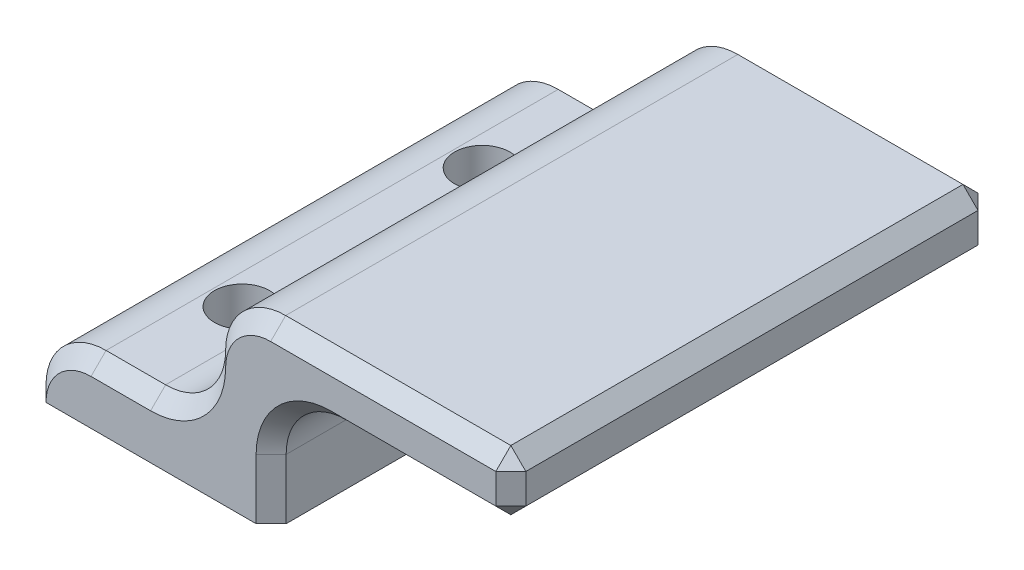
ISO-10303-21;
HEADER;
FILE_DESCRIPTION(('STEP AP214'),'2;1');
FILE_NAME('part.step','',(''),(''),'','','');
FILE_SCHEMA(('AUTOMOTIVE_DESIGN { 1 0 10303 214 1 1 1 1 }'));
ENDSEC;
DATA;
#1=APPLICATION_CONTEXT('core data for automotive mechanical design processes');
#2=APPLICATION_PROTOCOL_DEFINITION('international standard','automotive_design',2000,#1);
#3=PRODUCT_CONTEXT('',#1,'mechanical');
#4=PRODUCT('Part','Part','',(#3));
#5=PRODUCT_RELATED_PRODUCT_CATEGORY('part','',(#4));
#6=PRODUCT_DEFINITION_FORMATION('','',#4);
#7=PRODUCT_DEFINITION_CONTEXT('part definition',#1,'design');
#8=PRODUCT_DEFINITION('design','',#6,#7);
#9=PRODUCT_DEFINITION_SHAPE('','',#8);
#10=(LENGTH_UNIT() NAMED_UNIT(*) SI_UNIT(.MILLI.,.METRE.));
#11=(NAMED_UNIT(*) PLANE_ANGLE_UNIT() SI_UNIT($,.RADIAN.));
#12=(NAMED_UNIT(*) SI_UNIT($,.STERADIAN.) SOLID_ANGLE_UNIT());
#13=UNCERTAINTY_MEASURE_WITH_UNIT(LENGTH_MEASURE(1.E-05),#10,'distance_accuracy_value','');
#14=(GEOMETRIC_REPRESENTATION_CONTEXT(3) GLOBAL_UNCERTAINTY_ASSIGNED_CONTEXT((#13)) GLOBAL_UNIT_ASSIGNED_CONTEXT((#10,
#11,#12)) REPRESENTATION_CONTEXT('',''));
#15=CARTESIAN_POINT('',(0.,0.,0.));
#16=DIRECTION('',(0.,0.,1.));
#17=DIRECTION('',(1.,0.,0.));
#18=AXIS2_PLACEMENT_3D('',#15,#16,#17);
#19=CARTESIAN_POINT('',(-22.2,-9.525,25.5));
#20=DIRECTION('',(0.,1.,0.));
#21=DIRECTION('',(-1.,0.,0.));
#22=AXIS2_PLACEMENT_3D('',#19,#20,#21);
#23=PLANE('',#22);
#24=CARTESIAN_POINT('',(-12.675,-9.52500000000002,-12.7));
#25=DIRECTION('',(0.,-1.,0.));
#26=DIRECTION('',(-1.,0.,0.));
#27=AXIS2_PLACEMENT_3D('',#24,#25,#26);
#28=CIRCLE('',#27,2.921);
#29=CARTESIAN_POINT('',(-15.596,-9.52500000000002,-12.7));
#30=VERTEX_POINT('',#29);
#31=EDGE_CURVE('E417',#30,#30,#28,.T.);
#32=ORIENTED_EDGE('',*,*,#31,.F.);
#33=EDGE_LOOP('',(#32));
#34=FACE_BOUND('',#33,.T.);
#35=CARTESIAN_POINT('',(-12.675,-9.52500000000001,12.7));
#36=DIRECTION('',(0.,1.,0.));
#37=DIRECTION('',(-1.,0.,0.));
#38=AXIS2_PLACEMENT_3D('',#35,#36,#37);
#39=CIRCLE('',#38,2.921);
#40=CARTESIAN_POINT('',(-15.596,-9.52500000000001,12.7));
#41=VERTEX_POINT('',#40);
#42=EDGE_CURVE('E463',#41,#41,#39,.T.);
#43=ORIENTED_EDGE('',*,*,#42,.T.);
#44=EDGE_LOOP('',(#43));
#45=FACE_BOUND('',#44,.T.);
#46=DIRECTION('',(0.,0.,-1.));
#47=VECTOR('',#46,1.);
#48=CARTESIAN_POINT('',(3.2,-9.525,25.5));
#49=LINE('',#48,#47);
#50=CARTESIAN_POINT('',(3.2,-9.525,23.9125));
#51=VERTEX_POINT('',#50);
#52=CARTESIAN_POINT('',(3.2,-9.525,-23.9125));
#53=VERTEX_POINT('',#52);
#54=EDGE_CURVE('E215',#51,#53,#49,.T.);
#55=ORIENTED_EDGE('',*,*,#54,.F.);
#56=DIRECTION('',(-0.707106781186546,0.,0.707106781186549));
#57=VECTOR('',#56,1.);
#58=CARTESIAN_POINT('',(1.6125,-9.525,25.5));
#59=LINE('',#58,#57);
#60=CARTESIAN_POINT('',(1.6125,-9.525,25.5));
#61=VERTEX_POINT('',#60);
#62=EDGE_CURVE('E213',#51,#61,#59,.T.);
#63=ORIENTED_EDGE('',*,*,#62,.T.);
#64=DIRECTION('',(1.,0.,0.));
#65=VECTOR('',#64,1.);
#66=CARTESIAN_POINT('',(-22.2,-9.525,25.5));
#67=LINE('',#66,#65);
#68=CARTESIAN_POINT('',(-20.6125,-9.525,25.5));
#69=VERTEX_POINT('',#68);
#70=EDGE_CURVE('E196',#69,#61,#67,.T.);
#71=ORIENTED_EDGE('',*,*,#70,.F.);
#72=DIRECTION('',(0.707106781186546,0.,0.707106781186549));
#73=VECTOR('',#72,1.);
#74=CARTESIAN_POINT('',(-15.85,-9.525,30.2625));
#75=LINE('',#74,#73);
#76=CARTESIAN_POINT('',(-22.2,-9.525,23.9125));
#77=VERTEX_POINT('',#76);
#78=EDGE_CURVE('E210',#69,#77,#75,.F.);
#79=ORIENTED_EDGE('',*,*,#78,.T.);
#80=DIRECTION('',(0.,0.,-1.));
#81=VECTOR('',#80,1.);
#82=CARTESIAN_POINT('',(-22.2,-9.525,25.5));
#83=LINE('',#82,#81);
#84=CARTESIAN_POINT('',(-22.2,-9.525,-23.9125));
#85=VERTEX_POINT('',#84);
#86=EDGE_CURVE('E455',#77,#85,#83,.T.);
#87=ORIENTED_EDGE('',*,*,#86,.T.);
#88=DIRECTION('',(-0.707106781186546,0.,0.707106781186549));
#89=VECTOR('',#88,1.);
#90=CARTESIAN_POINT('',(-15.85,-9.525,-30.2625));
#91=LINE('',#90,#89);
#92=CARTESIAN_POINT('',(-20.6125,-9.525,-25.5));
#93=VERTEX_POINT('',#92);
#94=EDGE_CURVE('E228',#85,#93,#91,.F.);
#95=ORIENTED_EDGE('',*,*,#94,.T.);
#96=DIRECTION('',(1.,0.,0.));
#97=VECTOR('',#96,1.);
#98=CARTESIAN_POINT('',(-22.2,-9.525,-25.5));
#99=LINE('',#98,#97);
#100=CARTESIAN_POINT('',(1.6125,-9.525,-25.5));
#101=VERTEX_POINT('',#100);
#102=EDGE_CURVE('E216',#93,#101,#99,.T.);
#103=ORIENTED_EDGE('',*,*,#102,.T.);
#104=DIRECTION('',(-0.707106781186549,0.,-0.707106781186546));
#105=VECTOR('',#104,1.);
#106=CARTESIAN_POINT('',(3.2,-9.525,-23.9125));
#107=LINE('',#106,#105);
#108=EDGE_CURVE('E222',#101,#53,#107,.F.);
#109=ORIENTED_EDGE('',*,*,#108,.T.);
#110=EDGE_LOOP('',(#55,#63,#71,#79,#87,#95,#103,#109));
#111=FACE_BOUND('',#110,.T.);
#112=ADVANCED_FACE('F41',(#34,#45,#111),#23,.F.);
#113=CARTESIAN_POINT('',(3.2,-9.525,25.5));
#114=DIRECTION('',(-1.,0.,0.));
#115=DIRECTION('',(0.,-1.,0.));
#116=AXIS2_PLACEMENT_3D('',#113,#114,#115);
#117=PLANE('',#116);
#118=DIRECTION('',(0.,0.,-1.));
#119=VECTOR('',#118,1.);
#120=CARTESIAN_POINT('',(3.2,-3.175,25.5));
#121=LINE('',#120,#119);
#122=CARTESIAN_POINT('',(3.2,-3.175,-23.9125));
#123=VERTEX_POINT('',#122);
#124=CARTESIAN_POINT('',(3.2,-3.175,23.9125));
#125=VERTEX_POINT('',#124);
#126=EDGE_CURVE('E508',#123,#125,#121,.F.);
#127=ORIENTED_EDGE('',*,*,#126,.T.);
#128=DIRECTION('',(0.,-1.,0.));
#129=VECTOR('',#128,1.);
#130=CARTESIAN_POINT('',(3.2,-9.525,23.9125));
#131=LINE('',#130,#129);
#132=EDGE_CURVE('E448',#125,#51,#131,.T.);
#133=ORIENTED_EDGE('',*,*,#132,.T.);
#134=ORIENTED_EDGE('',*,*,#54,.T.);
#135=DIRECTION('',(0.,1.,0.));
#136=VECTOR('',#135,1.);
#137=CARTESIAN_POINT('',(3.2,-9.525,-23.9125));
#138=LINE('',#137,#136);
#139=EDGE_CURVE('E445',#53,#123,#138,.T.);
#140=ORIENTED_EDGE('',*,*,#139,.T.);
#141=EDGE_LOOP('',(#127,#133,#134,#140));
#142=FACE_BOUND('',#141,.T.);
#143=ADVANCED_FACE('F520',(#142),#117,.F.);
#144=CARTESIAN_POINT('',(3.2,3.175,25.5));
#145=DIRECTION('',(0.,1.,0.));
#146=DIRECTION('',(0.,0.,1.));
#147=AXIS2_PLACEMENT_3D('',#144,#145,#146);
#148=PLANE('',#147);
#149=DIRECTION('',(0.,0.,1.));
#150=VECTOR('',#149,1.);
#151=CARTESIAN_POINT('',(26.9625,3.175,25.5));
#152=LINE('',#151,#150);
#153=CARTESIAN_POINT('',(26.9625,3.175,-23.9125));
#154=VERTEX_POINT('',#153);
#155=CARTESIAN_POINT('',(26.9625,3.175,23.9125));
#156=VERTEX_POINT('',#155);
#157=EDGE_CURVE('E237',#154,#156,#152,.T.);
#158=ORIENTED_EDGE('',*,*,#157,.T.);
#159=DIRECTION('',(-1.,0.,0.));
#160=VECTOR('',#159,1.);
#161=CARTESIAN_POINT('',(9.55,3.175,23.9125));
#162=LINE('',#161,#160);
#163=CARTESIAN_POINT('',(9.55,3.175,23.9125));
#164=VERTEX_POINT('',#163);
#165=EDGE_CURVE('E243',#156,#164,#162,.T.);
#166=ORIENTED_EDGE('',*,*,#165,.T.);
#167=DIRECTION('',(0.,0.,-1.));
#168=VECTOR('',#167,1.);
#169=CARTESIAN_POINT('',(9.55,3.175,-25.5));
#170=LINE('',#169,#168);
#171=CARTESIAN_POINT('',(9.55,3.175,-23.9125));
#172=VERTEX_POINT('',#171);
#173=EDGE_CURVE('E504',#164,#172,#170,.T.);
#174=ORIENTED_EDGE('',*,*,#173,.T.);
#175=DIRECTION('',(1.,0.,0.));
#176=VECTOR('',#175,1.);
#177=CARTESIAN_POINT('',(3.2,3.175,-23.9125));
#178=LINE('',#177,#176);
#179=EDGE_CURVE('E240',#172,#154,#178,.T.);
#180=ORIENTED_EDGE('',*,*,#179,.T.);
#181=EDGE_LOOP('',(#158,#166,#174,#180));
#182=FACE_BOUND('',#181,.T.);
#183=ADVANCED_FACE('F500',(#182),#148,.F.);
#184=CARTESIAN_POINT('',(28.55,3.175,25.5));
#185=DIRECTION('',(-1.,0.,0.));
#186=DIRECTION('',(0.,-1.,0.));
#187=AXIS2_PLACEMENT_3D('',#184,#185,#186);
#188=PLANE('',#187);
#189=DIRECTION('',(0.,0.,1.));
#190=VECTOR('',#189,1.);
#191=CARTESIAN_POINT('',(28.55,7.9375,25.5));
#192=LINE('',#191,#190);
#193=CARTESIAN_POINT('',(28.55,7.9375,-23.9125));
#194=VERTEX_POINT('',#193);
#195=CARTESIAN_POINT('',(28.55,7.9375,23.9125));
#196=VERTEX_POINT('',#195);
#197=EDGE_CURVE('E52',#194,#196,#192,.T.);
#198=ORIENTED_EDGE('',*,*,#197,.T.);
#199=DIRECTION('',(0.,-1.,0.));
#200=VECTOR('',#199,1.);
#201=CARTESIAN_POINT('',(28.55,3.175,23.9125));
#202=LINE('',#201,#200);
#203=CARTESIAN_POINT('',(28.55,4.7625,23.9125));
#204=VERTEX_POINT('',#203);
#205=EDGE_CURVE('E11',#196,#204,#202,.T.);
#206=ORIENTED_EDGE('',*,*,#205,.T.);
#207=DIRECTION('',(0.,0.,-1.));
#208=VECTOR('',#207,1.);
#209=CARTESIAN_POINT('',(28.55,4.7625,25.5));
#210=LINE('',#209,#208);
#211=CARTESIAN_POINT('',(28.55,4.7625,-23.9125));
#212=VERTEX_POINT('',#211);
#213=EDGE_CURVE('E305',#204,#212,#210,.T.);
#214=ORIENTED_EDGE('',*,*,#213,.T.);
#215=DIRECTION('',(0.,1.,0.));
#216=VECTOR('',#215,1.);
#217=CARTESIAN_POINT('',(28.55,3.175,-23.9125));
#218=LINE('',#217,#216);
#219=EDGE_CURVE('E63',#212,#194,#218,.T.);
#220=ORIENTED_EDGE('',*,*,#219,.T.);
#221=EDGE_LOOP('',(#198,#206,#214,#220));
#222=FACE_BOUND('',#221,.T.);
#223=ADVANCED_FACE('F774',(#222),#188,.F.);
#224=CARTESIAN_POINT('',(28.55,9.525,25.5));
#225=DIRECTION('',(0.,-1.,0.));
#226=DIRECTION('',(1.,0.,0.));
#227=AXIS2_PLACEMENT_3D('',#224,#225,#226);
#228=PLANE('',#227);
#229=DIRECTION('',(0.,0.,-1.));
#230=VECTOR('',#229,1.);
#231=CARTESIAN_POINT('',(3.15,9.525,25.5));
#232=LINE('',#231,#230);
#233=CARTESIAN_POINT('',(3.15,9.525,-23.9125));
#234=VERTEX_POINT('',#233);
#235=CARTESIAN_POINT('',(3.15,9.525,23.9125));
#236=VERTEX_POINT('',#235);
#237=EDGE_CURVE('E421',#234,#236,#232,.F.);
#238=ORIENTED_EDGE('',*,*,#237,.T.);
#239=DIRECTION('',(1.,0.,0.));
#240=VECTOR('',#239,1.);
#241=CARTESIAN_POINT('',(28.55,9.525,23.9125));
#242=LINE('',#241,#240);
#243=CARTESIAN_POINT('',(26.9625,9.525,23.9125));
#244=VERTEX_POINT('',#243);
#245=EDGE_CURVE('E302',#236,#244,#242,.T.);
#246=ORIENTED_EDGE('',*,*,#245,.T.);
#247=DIRECTION('',(0.,0.,-1.));
#248=VECTOR('',#247,1.);
#249=CARTESIAN_POINT('',(26.9625,9.525,25.5));
#250=LINE('',#249,#248);
#251=CARTESIAN_POINT('',(26.9625,9.525,-23.9125));
#252=VERTEX_POINT('',#251);
#253=EDGE_CURVE('E299',#244,#252,#250,.T.);
#254=ORIENTED_EDGE('',*,*,#253,.T.);
#255=DIRECTION('',(-1.,0.,0.));
#256=VECTOR('',#255,1.);
#257=CARTESIAN_POINT('',(28.55,9.525,-23.9125));
#258=LINE('',#257,#256);
#259=EDGE_CURVE('E296',#252,#234,#258,.T.);
#260=ORIENTED_EDGE('',*,*,#259,.T.);
#261=EDGE_LOOP('',(#238,#246,#254,#260));
#262=FACE_BOUND('',#261,.T.);
#263=ADVANCED_FACE('F543',(#262),#228,.F.);
#264=CARTESIAN_POINT('',(-3.2,-3.175,25.5));
#265=DIRECTION('',(0.,-1.,0.));
#266=DIRECTION('',(1.,0.,0.));
#267=AXIS2_PLACEMENT_3D('',#264,#265,#266);
#268=PLANE('',#267);
#269=CARTESIAN_POINT('',(-12.675,-3.175,-12.7));
#270=DIRECTION('',(0.,-1.,0.));
#271=DIRECTION('',(-1.,0.,0.));
#272=AXIS2_PLACEMENT_3D('',#269,#270,#271);
#273=CIRCLE('',#272,2.921);
#274=CARTESIAN_POINT('',(-15.596,-3.175,-12.7));
#275=VERTEX_POINT('',#274);
#276=EDGE_CURVE('E411',#275,#275,#273,.T.);
#277=ORIENTED_EDGE('',*,*,#276,.T.);
#278=EDGE_LOOP('',(#277));
#279=FACE_BOUND('',#278,.T.);
#280=CARTESIAN_POINT('',(-12.675,-3.175,12.7));
#281=DIRECTION('',(0.,1.,0.));
#282=DIRECTION('',(-1.,0.,0.));
#283=AXIS2_PLACEMENT_3D('',#280,#281,#282);
#284=CIRCLE('',#283,2.921);
#285=CARTESIAN_POINT('',(-15.596,-3.175,12.7));
#286=VERTEX_POINT('',#285);
#287=EDGE_CURVE('E982',#286,#286,#284,.T.);
#288=ORIENTED_EDGE('',*,*,#287,.F.);
#289=EDGE_LOOP('',(#288));
#290=FACE_BOUND('',#289,.T.);
#291=DIRECTION('',(0.,0.,-1.));
#292=VECTOR('',#291,1.);
#293=CARTESIAN_POINT('',(-15.85,-3.175,25.5));
#294=LINE('',#293,#292);
#295=CARTESIAN_POINT('',(-15.85,-3.175,-23.9125));
#296=VERTEX_POINT('',#295);
#297=CARTESIAN_POINT('',(-15.85,-3.175,23.9125));
#298=VERTEX_POINT('',#297);
#299=EDGE_CURVE('E533',#296,#298,#294,.F.);
#300=ORIENTED_EDGE('',*,*,#299,.T.);
#301=DIRECTION('',(1.,0.,0.));
#302=VECTOR('',#301,1.);
#303=CARTESIAN_POINT('',(-9.55,-3.175,23.9125));
#304=LINE('',#303,#302);
#305=CARTESIAN_POINT('',(-9.55,-3.175,23.9125));
#306=VERTEX_POINT('',#305);
#307=EDGE_CURVE('E254',#298,#306,#304,.T.);
#308=ORIENTED_EDGE('',*,*,#307,.T.);
#309=DIRECTION('',(0.,0.,-1.));
#310=VECTOR('',#309,1.);
#311=CARTESIAN_POINT('',(-9.55,-3.175,-25.5));
#312=LINE('',#311,#310);
#313=CARTESIAN_POINT('',(-9.55,-3.175,-23.9125));
#314=VERTEX_POINT('',#313);
#315=EDGE_CURVE('E530',#306,#314,#312,.T.);
#316=ORIENTED_EDGE('',*,*,#315,.T.);
#317=DIRECTION('',(-1.,0.,0.));
#318=VECTOR('',#317,1.);
#319=CARTESIAN_POINT('',(-3.2,-3.175,-23.9125));
#320=LINE('',#319,#318);
#321=EDGE_CURVE('E251',#314,#296,#320,.T.);
#322=ORIENTED_EDGE('',*,*,#321,.T.);
#323=EDGE_LOOP('',(#300,#308,#316,#322));
#324=FACE_BOUND('',#323,.T.);
#325=ADVANCED_FACE('F760',(#279,#290,#324),#268,.F.);
#326=CARTESIAN_POINT('',(0.,0.,25.5));
#327=DIRECTION('',(0.,0.,1.));
#328=DIRECTION('',(1.,0.,0.));
#329=AXIS2_PLACEMENT_3D('',#326,#327,#328);
#330=PLANE('',#329);
#331=ORIENTED_EDGE('',*,*,#70,.T.);
#332=DIRECTION('',(0.,1.,0.));
#333=VECTOR('',#332,1.);
#334=CARTESIAN_POINT('',(1.6125,-3.175,25.5));
#335=LINE('',#334,#333);
#336=CARTESIAN_POINT('',(1.6125,-3.175,25.5));
#337=VERTEX_POINT('',#336);
#338=EDGE_CURVE('E442',#61,#337,#335,.T.);
#339=ORIENTED_EDGE('',*,*,#338,.T.);
#340=CARTESIAN_POINT('',(9.55,-3.175,25.5));
#341=DIRECTION('',(0.,0.,1.));
#342=DIRECTION('',(1.,0.,0.));
#343=AXIS2_PLACEMENT_3D('',#340,#341,#342);
#344=CIRCLE('',#343,7.9375);
#345=CARTESIAN_POINT('',(9.55,4.7625,25.5));
#346=VERTEX_POINT('',#345);
#347=EDGE_CURVE('E439',#337,#346,#344,.F.);
#348=ORIENTED_EDGE('',*,*,#347,.T.);
#349=DIRECTION('',(1.,0.,0.));
#350=VECTOR('',#349,1.);
#351=CARTESIAN_POINT('',(28.55,4.7625,25.5));
#352=LINE('',#351,#350);
#353=CARTESIAN_POINT('',(26.9625,4.7625,25.5));
#354=VERTEX_POINT('',#353);
#355=EDGE_CURVE('E205',#346,#354,#352,.T.);
#356=ORIENTED_EDGE('',*,*,#355,.T.);
#357=DIRECTION('',(0.,1.,0.));
#358=VECTOR('',#357,1.);
#359=CARTESIAN_POINT('',(26.9625,9.525,25.5));
#360=LINE('',#359,#358);
#361=CARTESIAN_POINT('',(26.9625,7.9375,25.5));
#362=VERTEX_POINT('',#361);
#363=EDGE_CURVE('E423',#354,#362,#360,.T.);
#364=ORIENTED_EDGE('',*,*,#363,.T.);
#365=DIRECTION('',(-1.,0.,0.));
#366=VECTOR('',#365,1.);
#367=CARTESIAN_POINT('',(3.15,7.9375,25.5));
#368=LINE('',#367,#366);
#369=CARTESIAN_POINT('',(3.15,7.9375,25.5));
#370=VERTEX_POINT('',#369);
#371=EDGE_CURVE('E426',#362,#370,#368,.T.);
#372=ORIENTED_EDGE('',*,*,#371,.T.);
#373=CARTESIAN_POINT('',(3.15,3.175,25.5));
#374=DIRECTION('',(0.,0.,1.));
#375=DIRECTION('',(1.,0.,0.));
#376=AXIS2_PLACEMENT_3D('',#373,#374,#375);
#377=CIRCLE('',#376,4.7625);
#378=CARTESIAN_POINT('',(-1.6125,3.175,25.5));
#379=VERTEX_POINT('',#378);
#380=EDGE_CURVE('E429',#370,#379,#377,.T.);
#381=ORIENTED_EDGE('',*,*,#380,.T.);
#382=CARTESIAN_POINT('',(-9.55,3.175,25.5));
#383=DIRECTION('',(0.,0.,1.));
#384=DIRECTION('',(1.,0.,0.));
#385=AXIS2_PLACEMENT_3D('',#382,#383,#384);
#386=CIRCLE('',#385,7.9375);
#387=CARTESIAN_POINT('',(-9.55,-4.7625,25.5));
#388=VERTEX_POINT('',#387);
#389=EDGE_CURVE('E432',#379,#388,#386,.F.);
#390=ORIENTED_EDGE('',*,*,#389,.T.);
#391=DIRECTION('',(-1.,0.,0.));
#392=VECTOR('',#391,1.);
#393=CARTESIAN_POINT('',(-15.85,-4.7625,25.5));
#394=LINE('',#393,#392);
#395=CARTESIAN_POINT('',(-15.85,-4.7625,25.5));
#396=VERTEX_POINT('',#395);
#397=EDGE_CURVE('E199',#388,#396,#394,.T.);
#398=ORIENTED_EDGE('',*,*,#397,.T.);
#399=CARTESIAN_POINT('',(-15.85,-9.525,25.5));
#400=DIRECTION('',(0.,0.,1.));
#401=DIRECTION('',(1.,0.,0.));
#402=AXIS2_PLACEMENT_3D('',#399,#400,#401);
#403=CIRCLE('',#402,4.7625);
#404=EDGE_CURVE('E192',#396,#69,#403,.T.);
#405=ORIENTED_EDGE('',*,*,#404,.T.);
#406=EDGE_LOOP('',(#331,#339,#348,#356,#364,#372,#381,#390,#398,#405));
#407=FACE_BOUND('',#406,.T.);
#408=ADVANCED_FACE('F194',(#407),#330,.T.);
#409=CARTESIAN_POINT('',(0.,0.,-25.5));
#410=DIRECTION('',(0.,0.,1.));
#411=DIRECTION('',(1.,0.,0.));
#412=AXIS2_PLACEMENT_3D('',#409,#410,#411);
#413=PLANE('',#412);
#414=CARTESIAN_POINT('',(9.55,-3.175,-25.5));
#415=DIRECTION('',(0.,0.,1.));
#416=DIRECTION('',(1.,0.,0.));
#417=AXIS2_PLACEMENT_3D('',#414,#415,#416);
#418=CIRCLE('',#417,7.9375);
#419=CARTESIAN_POINT('',(9.55,4.7625,-25.5));
#420=VERTEX_POINT('',#419);
#421=CARTESIAN_POINT('',(1.6125,-3.175,-25.5));
#422=VERTEX_POINT('',#421);
#423=EDGE_CURVE('E290',#420,#422,#418,.T.);
#424=ORIENTED_EDGE('',*,*,#423,.T.);
#425=DIRECTION('',(0.,-1.,0.));
#426=VECTOR('',#425,1.);
#427=CARTESIAN_POINT('',(1.61249999999999,0.,-25.5));
#428=LINE('',#427,#426);
#429=EDGE_CURVE('E293',#422,#101,#428,.T.);
#430=ORIENTED_EDGE('',*,*,#429,.T.);
#431=ORIENTED_EDGE('',*,*,#102,.F.);
#432=CARTESIAN_POINT('',(-15.85,-9.525,-25.5));
#433=DIRECTION('',(0.,0.,1.));
#434=DIRECTION('',(1.,0.,0.));
#435=AXIS2_PLACEMENT_3D('',#432,#433,#434);
#436=CIRCLE('',#435,4.7625);
#437=CARTESIAN_POINT('',(-15.85,-4.7625,-25.5));
#438=VERTEX_POINT('',#437);
#439=EDGE_CURVE('E284',#93,#438,#436,.F.);
#440=ORIENTED_EDGE('',*,*,#439,.T.);
#441=DIRECTION('',(1.,0.,0.));
#442=VECTOR('',#441,1.);
#443=CARTESIAN_POINT('',(0.,-4.7625,-25.5));
#444=LINE('',#443,#442);
#445=CARTESIAN_POINT('',(-9.55,-4.7625,-25.5));
#446=VERTEX_POINT('',#445);
#447=EDGE_CURVE('E281',#438,#446,#444,.T.);
#448=ORIENTED_EDGE('',*,*,#447,.T.);
#449=CARTESIAN_POINT('',(-9.55,3.175,-25.5));
#450=DIRECTION('',(0.,0.,1.));
#451=DIRECTION('',(1.,0.,0.));
#452=AXIS2_PLACEMENT_3D('',#449,#450,#451);
#453=CIRCLE('',#452,7.9375);
#454=CARTESIAN_POINT('',(-1.6125,3.175,-25.5));
#455=VERTEX_POINT('',#454);
#456=EDGE_CURVE('E278',#446,#455,#453,.T.);
#457=ORIENTED_EDGE('',*,*,#456,.T.);
#458=CARTESIAN_POINT('',(3.15,3.175,-25.5));
#459=DIRECTION('',(0.,0.,1.));
#460=DIRECTION('',(1.,0.,0.));
#461=AXIS2_PLACEMENT_3D('',#458,#459,#460);
#462=CIRCLE('',#461,4.7625);
#463=CARTESIAN_POINT('',(3.15,7.93749999999999,-25.5));
#464=VERTEX_POINT('',#463);
#465=EDGE_CURVE('E275',#455,#464,#462,.F.);
#466=ORIENTED_EDGE('',*,*,#465,.T.);
#467=DIRECTION('',(1.,0.,0.));
#468=VECTOR('',#467,1.);
#469=CARTESIAN_POINT('',(0.,7.93749999999999,-25.5));
#470=LINE('',#469,#468);
#471=CARTESIAN_POINT('',(26.9625,7.93749999999999,-25.5));
#472=VERTEX_POINT('',#471);
#473=EDGE_CURVE('E272',#464,#472,#470,.T.);
#474=ORIENTED_EDGE('',*,*,#473,.T.);
#475=DIRECTION('',(0.,-1.,0.));
#476=VECTOR('',#475,1.);
#477=CARTESIAN_POINT('',(26.9625,0.,-25.5));
#478=LINE('',#477,#476);
#479=CARTESIAN_POINT('',(26.9625,4.7625,-25.5));
#480=VERTEX_POINT('',#479);
#481=EDGE_CURVE('E269',#472,#480,#478,.T.);
#482=ORIENTED_EDGE('',*,*,#481,.T.);
#483=DIRECTION('',(-1.,0.,0.));
#484=VECTOR('',#483,1.);
#485=CARTESIAN_POINT('',(0.,4.7625,-25.5));
#486=LINE('',#485,#484);
#487=EDGE_CURVE('E287',#480,#420,#486,.T.);
#488=ORIENTED_EDGE('',*,*,#487,.T.);
#489=EDGE_LOOP('',(#424,#430,#431,#440,#448,#457,#466,#474,#482,#488));
#490=FACE_BOUND('',#489,.T.);
#491=ADVANCED_FACE('F460',(#490),#413,.F.);
#492=CARTESIAN_POINT('',(-12.675,-9.52500000000001,12.7));
#493=DIRECTION('',(0.,1.,0.));
#494=DIRECTION('',(-1.,0.,0.));
#495=AXIS2_PLACEMENT_3D('',#492,#493,#494);
#496=CYLINDRICAL_SURFACE('',#495,2.921);
#497=ORIENTED_EDGE('',*,*,#42,.F.);
#498=EDGE_LOOP('',(#497));
#499=FACE_BOUND('',#498,.T.);
#500=ORIENTED_EDGE('',*,*,#287,.T.);
#501=EDGE_LOOP('',(#500));
#502=FACE_BOUND('',#501,.T.);
#503=ADVANCED_FACE('F740',(#499,#502),#496,.F.);
#504=CARTESIAN_POINT('',(-12.675,-9.52500000000002,-12.7));
#505=DIRECTION('',(0.,1.,0.));
#506=DIRECTION('',(-1.,0.,0.));
#507=AXIS2_PLACEMENT_3D('',#504,#505,#506);
#508=CYLINDRICAL_SURFACE('',#507,2.921);
#509=ORIENTED_EDGE('',*,*,#31,.T.);
#510=EDGE_LOOP('',(#509));
#511=FACE_BOUND('',#510,.T.);
#512=ORIENTED_EDGE('',*,*,#276,.F.);
#513=EDGE_LOOP('',(#512));
#514=FACE_BOUND('',#513,.T.);
#515=ADVANCED_FACE('F588',(#511,#514),#508,.F.);
#516=CARTESIAN_POINT('',(9.55,-3.175,25.5));
#517=DIRECTION('',(0.,0.,1.));
#518=DIRECTION('',(1.,0.,0.));
#519=AXIS2_PLACEMENT_3D('',#516,#517,#518);
#520=CYLINDRICAL_SURFACE('',#519,6.35);
#521=ORIENTED_EDGE('',*,*,#173,.F.);
#522=CARTESIAN_POINT('',(9.55,-3.175,23.9125));
#523=DIRECTION('',(0.,0.,1.));
#524=DIRECTION('',(1.,0.,0.));
#525=AXIS2_PLACEMENT_3D('',#522,#523,#524);
#526=CIRCLE('',#525,6.35);
#527=EDGE_CURVE('E234',#164,#125,#526,.T.);
#528=ORIENTED_EDGE('',*,*,#527,.T.);
#529=ORIENTED_EDGE('',*,*,#126,.F.);
#530=CARTESIAN_POINT('',(9.55,-3.175,-23.9125));
#531=DIRECTION('',(0.,0.,1.));
#532=DIRECTION('',(1.,0.,0.));
#533=AXIS2_PLACEMENT_3D('',#530,#531,#532);
#534=CIRCLE('',#533,6.35);
#535=EDGE_CURVE('E226',#123,#172,#534,.F.);
#536=ORIENTED_EDGE('',*,*,#535,.T.);
#537=EDGE_LOOP('',(#521,#528,#529,#536));
#538=FACE_BOUND('',#537,.T.);
#539=ADVANCED_FACE('F584',(#538),#520,.F.);
#540=CARTESIAN_POINT('',(-15.85,-9.525,25.5));
#541=DIRECTION('',(0.,0.,-1.));
#542=DIRECTION('',(-1.,0.,0.));
#543=AXIS2_PLACEMENT_3D('',#540,#541,#542);
#544=CYLINDRICAL_SURFACE('',#543,6.35);
#545=ORIENTED_EDGE('',*,*,#86,.F.);
#546=CARTESIAN_POINT('',(-15.85,-9.525,23.9125));
#547=DIRECTION('',(0.,0.,1.));
#548=DIRECTION('',(1.,0.,0.));
#549=AXIS2_PLACEMENT_3D('',#546,#547,#548);
#550=CIRCLE('',#549,6.35);
#551=EDGE_CURVE('E220',#77,#298,#550,.F.);
#552=ORIENTED_EDGE('',*,*,#551,.T.);
#553=ORIENTED_EDGE('',*,*,#299,.F.);
#554=CARTESIAN_POINT('',(-15.85,-9.525,-23.9125));
#555=DIRECTION('',(0.,0.,1.));
#556=DIRECTION('',(1.,0.,0.));
#557=AXIS2_PLACEMENT_3D('',#554,#555,#556);
#558=CIRCLE('',#557,6.35);
#559=EDGE_CURVE('E246',#296,#85,#558,.T.);
#560=ORIENTED_EDGE('',*,*,#559,.T.);
#561=EDGE_LOOP('',(#545,#552,#553,#560));
#562=FACE_BOUND('',#561,.T.);
#563=ADVANCED_FACE('F587',(#562),#544,.T.);
#564=CARTESIAN_POINT('',(3.15,3.175,25.5));
#565=DIRECTION('',(0.,0.,-1.));
#566=DIRECTION('',(-1.,0.,0.));
#567=AXIS2_PLACEMENT_3D('',#564,#565,#566);
#568=CYLINDRICAL_SURFACE('',#567,6.35);
#569=DIRECTION('',(0.,0.,-1.));
#570=VECTOR('',#569,1.);
#571=CARTESIAN_POINT('',(-3.2,3.175,25.5));
#572=LINE('',#571,#570);
#573=CARTESIAN_POINT('',(-3.2,3.175,23.9125));
#574=VERTEX_POINT('',#573);
#575=CARTESIAN_POINT('',(-3.2,3.175,-23.9125));
#576=VERTEX_POINT('',#575);
#577=EDGE_CURVE('E404',#574,#576,#572,.T.);
#578=ORIENTED_EDGE('',*,*,#577,.F.);
#579=CARTESIAN_POINT('',(3.15,3.175,23.9125));
#580=DIRECTION('',(0.,0.,1.));
#581=DIRECTION('',(1.,0.,0.));
#582=AXIS2_PLACEMENT_3D('',#579,#580,#581);
#583=CIRCLE('',#582,6.35);
#584=EDGE_CURVE('E266',#574,#236,#583,.F.);
#585=ORIENTED_EDGE('',*,*,#584,.T.);
#586=ORIENTED_EDGE('',*,*,#237,.F.);
#587=CARTESIAN_POINT('',(3.15,3.175,-23.9125));
#588=DIRECTION('',(0.,0.,1.));
#589=DIRECTION('',(1.,0.,0.));
#590=AXIS2_PLACEMENT_3D('',#587,#588,#589);
#591=CIRCLE('',#590,6.35);
#592=EDGE_CURVE('E263',#234,#576,#591,.T.);
#593=ORIENTED_EDGE('',*,*,#592,.T.);
#594=EDGE_LOOP('',(#578,#585,#586,#593));
#595=FACE_BOUND('',#594,.T.);
#596=ADVANCED_FACE('F591',(#595),#568,.T.);
#597=CARTESIAN_POINT('',(-9.55,3.175,25.5));
#598=DIRECTION('',(0.,0.,1.));
#599=DIRECTION('',(1.,0.,0.));
#600=AXIS2_PLACEMENT_3D('',#597,#598,#599);
#601=CYLINDRICAL_SURFACE('',#600,6.35);
#602=ORIENTED_EDGE('',*,*,#315,.F.);
#603=CARTESIAN_POINT('',(-9.55,3.175,23.9125));
#604=DIRECTION('',(0.,0.,1.));
#605=DIRECTION('',(1.,0.,0.));
#606=AXIS2_PLACEMENT_3D('',#603,#604,#605);
#607=CIRCLE('',#606,6.35);
#608=EDGE_CURVE('E260',#306,#574,#607,.T.);
#609=ORIENTED_EDGE('',*,*,#608,.T.);
#610=ORIENTED_EDGE('',*,*,#577,.T.);
#611=CARTESIAN_POINT('',(-9.55,3.175,-23.9125));
#612=DIRECTION('',(0.,0.,1.));
#613=DIRECTION('',(1.,0.,0.));
#614=AXIS2_PLACEMENT_3D('',#611,#612,#613);
#615=CIRCLE('',#614,6.35);
#616=EDGE_CURVE('E257',#576,#314,#615,.F.);
#617=ORIENTED_EDGE('',*,*,#616,.T.);
#618=EDGE_LOOP('',(#602,#609,#610,#617));
#619=FACE_BOUND('',#618,.T.);
#620=ADVANCED_FACE('F593',(#619),#601,.F.);
#621=CARTESIAN_POINT('',(-15.85,-9.525,-25.5));
#622=DIRECTION('',(0.,0.,1.));
#623=DIRECTION('',(1.,0.,0.));
#624=AXIS2_PLACEMENT_3D('',#621,#622,#623);
#625=CONICAL_SURFACE('',#624,4.7625,0.785398163397446);
#626=ORIENTED_EDGE('',*,*,#94,.F.);
#627=ORIENTED_EDGE('',*,*,#559,.F.);
#628=DIRECTION('',(0.,0.707106781186546,0.707106781186549));
#629=VECTOR('',#628,1.);
#630=CARTESIAN_POINT('',(-15.85,-4.7625,-25.5));
#631=LINE('',#630,#629);
#632=EDGE_CURVE('E46',#438,#296,#631,.T.);
#633=ORIENTED_EDGE('',*,*,#632,.F.);
#634=ORIENTED_EDGE('',*,*,#439,.F.);
#635=EDGE_LOOP('',(#626,#627,#633,#634));
#636=FACE_BOUND('',#635,.T.);
#637=ADVANCED_FACE('F44',(#636),#625,.T.);
#638=CARTESIAN_POINT('',(-3.2,-3.175,-23.9125));
#639=DIRECTION('',(0.,-0.707106781186546,0.707106781186549));
#640=DIRECTION('',(-1.,0.,0.));
#641=AXIS2_PLACEMENT_3D('',#638,#639,#640);
#642=PLANE('',#641);
#643=ORIENTED_EDGE('',*,*,#632,.T.);
#644=ORIENTED_EDGE('',*,*,#321,.F.);
#645=DIRECTION('',(0.,0.707106781186549,0.707106781186546));
#646=VECTOR('',#645,1.);
#647=CARTESIAN_POINT('',(-9.55,-4.7625,-25.5));
#648=LINE('',#647,#646);
#649=EDGE_CURVE('E395',#446,#314,#648,.T.);
#650=ORIENTED_EDGE('',*,*,#649,.F.);
#651=ORIENTED_EDGE('',*,*,#447,.F.);
#652=EDGE_LOOP('',(#643,#644,#650,#651));
#653=FACE_BOUND('',#652,.T.);
#654=ADVANCED_FACE('F465',(#653),#642,.F.);
#655=CARTESIAN_POINT('',(-15.85,-9.525,25.5));
#656=DIRECTION('',(0.,0.,-1.));
#657=DIRECTION('',(-1.,0.,0.));
#658=AXIS2_PLACEMENT_3D('',#655,#656,#657);
#659=CONICAL_SURFACE('',#658,4.7625,0.785398163397446);
#660=ORIENTED_EDGE('',*,*,#78,.F.);
#661=ORIENTED_EDGE('',*,*,#404,.F.);
#662=DIRECTION('',(0.,-0.707106781186546,0.707106781186549));
#663=VECTOR('',#662,1.);
#664=CARTESIAN_POINT('',(-15.85,-3.175,23.9125));
#665=LINE('',#664,#663);
#666=EDGE_CURVE('E393',#298,#396,#665,.T.);
#667=ORIENTED_EDGE('',*,*,#666,.F.);
#668=ORIENTED_EDGE('',*,*,#551,.F.);
#669=EDGE_LOOP('',(#660,#661,#667,#668));
#670=FACE_BOUND('',#669,.T.);
#671=ADVANCED_FACE('F219',(#670),#659,.T.);
#672=CARTESIAN_POINT('',(-9.55,3.175,-25.5));
#673=DIRECTION('',(0.,0.,-1.));
#674=DIRECTION('',(-1.,0.,0.));
#675=AXIS2_PLACEMENT_3D('',#672,#673,#674);
#676=CONICAL_SURFACE('',#675,7.9375,0.785398163397446);
#677=ORIENTED_EDGE('',*,*,#649,.T.);
#678=ORIENTED_EDGE('',*,*,#616,.F.);
#679=DIRECTION('',(-0.707106781186545,0.,0.70710678118655));
#680=VECTOR('',#679,1.);
#681=CARTESIAN_POINT('',(-1.6125,3.175,-25.5));
#682=LINE('',#681,#680);
#683=EDGE_CURVE('E389',#455,#576,#682,.T.);
#684=ORIENTED_EDGE('',*,*,#683,.F.);
#685=ORIENTED_EDGE('',*,*,#456,.F.);
#686=EDGE_LOOP('',(#677,#678,#684,#685));
#687=FACE_BOUND('',#686,.T.);
#688=ADVANCED_FACE('F469',(#687),#676,.F.);
#689=CARTESIAN_POINT('',(0.,-4.76249999999999,25.5));
#690=DIRECTION('',(0.,0.707106781186549,0.707106781186546));
#691=DIRECTION('',(1.,0.,0.));
#692=AXIS2_PLACEMENT_3D('',#689,#690,#691);
#693=PLANE('',#692);
#694=ORIENTED_EDGE('',*,*,#666,.T.);
#695=ORIENTED_EDGE('',*,*,#397,.F.);
#696=DIRECTION('',(0.,-0.707106781186546,0.707106781186549));
#697=VECTOR('',#696,1.);
#698=CARTESIAN_POINT('',(-9.55,-3.175,23.9125));
#699=LINE('',#698,#697);
#700=EDGE_CURVE('E385',#306,#388,#699,.T.);
#701=ORIENTED_EDGE('',*,*,#700,.F.);
#702=ORIENTED_EDGE('',*,*,#307,.F.);
#703=EDGE_LOOP('',(#694,#695,#701,#702));
#704=FACE_BOUND('',#703,.T.);
#705=ADVANCED_FACE('F697',(#704),#693,.T.);
#706=CARTESIAN_POINT('',(3.15,3.175,-25.5));
#707=DIRECTION('',(0.,0.,1.));
#708=DIRECTION('',(1.,0.,0.));
#709=AXIS2_PLACEMENT_3D('',#706,#707,#708);
#710=CONICAL_SURFACE('',#709,4.7625,0.785398163397446);
#711=ORIENTED_EDGE('',*,*,#683,.T.);
#712=ORIENTED_EDGE('',*,*,#592,.F.);
#713=DIRECTION('',(0.,0.707106781186546,0.707106781186549));
#714=VECTOR('',#713,1.);
#715=CARTESIAN_POINT('',(3.15,7.9375,-25.5));
#716=LINE('',#715,#714);
#717=EDGE_CURVE('E381',#464,#234,#716,.T.);
#718=ORIENTED_EDGE('',*,*,#717,.F.);
#719=ORIENTED_EDGE('',*,*,#465,.F.);
#720=EDGE_LOOP('',(#711,#712,#718,#719));
#721=FACE_BOUND('',#720,.T.);
#722=ADVANCED_FACE('F472',(#721),#710,.T.);
#723=CARTESIAN_POINT('',(-9.55,3.175,25.5));
#724=DIRECTION('',(0.,0.,1.));
#725=DIRECTION('',(1.,0.,0.));
#726=AXIS2_PLACEMENT_3D('',#723,#724,#725);
#727=CONICAL_SURFACE('',#726,7.9375,0.785398163397446);
#728=ORIENTED_EDGE('',*,*,#700,.T.);
#729=ORIENTED_EDGE('',*,*,#389,.F.);
#730=DIRECTION('',(0.707106781186545,0.,0.70710678118655));
#731=VECTOR('',#730,1.);
#732=CARTESIAN_POINT('',(-3.2,3.175,23.9125));
#733=LINE('',#732,#731);
#734=EDGE_CURVE('E377',#574,#379,#733,.T.);
#735=ORIENTED_EDGE('',*,*,#734,.F.);
#736=ORIENTED_EDGE('',*,*,#608,.F.);
#737=EDGE_LOOP('',(#728,#729,#735,#736));
#738=FACE_BOUND('',#737,.T.);
#739=ADVANCED_FACE('F688',(#738),#727,.F.);
#740=CARTESIAN_POINT('',(28.55,9.525,-23.9125));
#741=DIRECTION('',(0.,-0.707106781186546,0.707106781186549));
#742=DIRECTION('',(-1.,0.,0.));
#743=AXIS2_PLACEMENT_3D('',#740,#741,#742);
#744=PLANE('',#743);
#745=ORIENTED_EDGE('',*,*,#717,.T.);
#746=ORIENTED_EDGE('',*,*,#259,.F.);
#747=DIRECTION('',(0.,-0.707106781186549,-0.707106781186546));
#748=VECTOR('',#747,1.);
#749=CARTESIAN_POINT('',(26.9625,9.525,-23.9125));
#750=LINE('',#749,#748);
#751=EDGE_CURVE('E373',#472,#252,#750,.F.);
#752=ORIENTED_EDGE('',*,*,#751,.F.);
#753=ORIENTED_EDGE('',*,*,#473,.F.);
#754=EDGE_LOOP('',(#745,#746,#752,#753));
#755=FACE_BOUND('',#754,.T.);
#756=ADVANCED_FACE('F477',(#755),#744,.F.);
#757=CARTESIAN_POINT('',(3.2,-9.525,-23.9125));
#758=DIRECTION('',(-0.707106781186546,0.,0.707106781186549));
#759=DIRECTION('',(0.,1.,0.));
#760=AXIS2_PLACEMENT_3D('',#757,#758,#759);
#761=PLANE('',#760);
#762=ORIENTED_EDGE('',*,*,#108,.F.);
#763=ORIENTED_EDGE('',*,*,#429,.F.);
#764=DIRECTION('',(-0.707106781186549,0.,-0.707106781186546));
#765=VECTOR('',#764,1.);
#766=CARTESIAN_POINT('',(3.2,-3.175,-23.9125));
#767=LINE('',#766,#765);
#768=EDGE_CURVE('E369',#123,#422,#767,.T.);
#769=ORIENTED_EDGE('',*,*,#768,.F.);
#770=ORIENTED_EDGE('',*,*,#139,.F.);
#771=EDGE_LOOP('',(#762,#763,#769,#770));
#772=FACE_BOUND('',#771,.T.);
#773=ADVANCED_FACE('F515',(#772),#761,.F.);
#774=CARTESIAN_POINT('',(3.15,3.175,25.5));
#775=DIRECTION('',(0.,0.,-1.));
#776=DIRECTION('',(-1.,0.,0.));
#777=AXIS2_PLACEMENT_3D('',#774,#775,#776);
#778=CONICAL_SURFACE('',#777,4.7625,0.785398163397446);
#779=ORIENTED_EDGE('',*,*,#734,.T.);
#780=ORIENTED_EDGE('',*,*,#380,.F.);
#781=DIRECTION('',(0.,-0.707106781186546,0.707106781186549));
#782=VECTOR('',#781,1.);
#783=CARTESIAN_POINT('',(3.15,9.525,23.9125));
#784=LINE('',#783,#782);
#785=EDGE_CURVE('E365',#236,#370,#784,.T.);
#786=ORIENTED_EDGE('',*,*,#785,.F.);
#787=ORIENTED_EDGE('',*,*,#584,.F.);
#788=EDGE_LOOP('',(#779,#780,#786,#787));
#789=FACE_BOUND('',#788,.T.);
#790=ADVANCED_FACE('F550',(#789),#778,.T.);
#791=CARTESIAN_POINT('',(26.9625,9.525,-23.9125));
#792=DIRECTION('',(0.577350269189622,0.577350269189626,-0.577350269189629));
#793=DIRECTION('',(0.,0.70710678118655,0.707106781186545));
#794=AXIS2_PLACEMENT_3D('',#791,#792,#793);
#795=PLANE('',#794);
#796=DIRECTION('',(0.707106781186549,0.,0.707106781186546));
#797=VECTOR('',#796,1.);
#798=CARTESIAN_POINT('',(27.75625,7.9375,-24.70625));
#799=LINE('',#798,#797);
#800=EDGE_CURVE('E358',#472,#194,#799,.T.);
#801=ORIENTED_EDGE('',*,*,#800,.F.);
#802=ORIENTED_EDGE('',*,*,#751,.T.);
#803=DIRECTION('',(-0.70710678118655,0.707106781186545,0.));
#804=VECTOR('',#803,1.);
#805=CARTESIAN_POINT('',(26.9625,9.525,-23.9125));
#806=LINE('',#805,#804);
#807=EDGE_CURVE('E361',#194,#252,#806,.T.);
#808=ORIENTED_EDGE('',*,*,#807,.F.);
#809=EDGE_LOOP('',(#801,#802,#808));
#810=FACE_BOUND('',#809,.T.);
#811=ADVANCED_FACE('F563',(#810),#795,.T.);
#812=CARTESIAN_POINT('',(9.55,-3.175,-25.5));
#813=DIRECTION('',(0.,0.,-1.));
#814=DIRECTION('',(-1.,0.,0.));
#815=AXIS2_PLACEMENT_3D('',#812,#813,#814);
#816=CONICAL_SURFACE('',#815,7.9375,0.785398163397446);
#817=ORIENTED_EDGE('',*,*,#768,.T.);
#818=ORIENTED_EDGE('',*,*,#423,.F.);
#819=DIRECTION('',(0.,0.707106781186546,-0.707106781186549));
#820=VECTOR('',#819,1.);
#821=CARTESIAN_POINT('',(9.55,3.175,-23.9125));
#822=LINE('',#821,#820);
#823=EDGE_CURVE('E354',#172,#420,#822,.T.);
#824=ORIENTED_EDGE('',*,*,#823,.F.);
#825=ORIENTED_EDGE('',*,*,#535,.F.);
#826=EDGE_LOOP('',(#817,#818,#824,#825));
#827=FACE_BOUND('',#826,.T.);
#828=ADVANCED_FACE('F512',(#827),#816,.F.);
#829=CARTESIAN_POINT('',(0.,7.9375,25.5));
#830=DIRECTION('',(0.,0.707106781186549,0.707106781186546));
#831=DIRECTION('',(1.,0.,0.));
#832=AXIS2_PLACEMENT_3D('',#829,#830,#831);
#833=PLANE('',#832);
#834=ORIENTED_EDGE('',*,*,#785,.T.);
#835=ORIENTED_EDGE('',*,*,#371,.F.);
#836=DIRECTION('',(0.,-0.707106781186546,0.707106781186549));
#837=VECTOR('',#836,1.);
#838=CARTESIAN_POINT('',(26.9625,9.525,23.9125));
#839=LINE('',#838,#837);
#840=EDGE_CURVE('E350',#244,#362,#839,.T.);
#841=ORIENTED_EDGE('',*,*,#840,.F.);
#842=ORIENTED_EDGE('',*,*,#245,.F.);
#843=EDGE_LOOP('',(#834,#835,#841,#842));
#844=FACE_BOUND('',#843,.T.);
#845=ADVANCED_FACE('F554',(#844),#833,.T.);
#846=CARTESIAN_POINT('',(26.9625,9.525,25.5));
#847=DIRECTION('',(-0.707106781186545,-0.70710678118655,0.));
#848=DIRECTION('',(0.,0.,-1.));
#849=AXIS2_PLACEMENT_3D('',#846,#847,#848);
#850=PLANE('',#849);
#851=ORIENTED_EDGE('',*,*,#807,.T.);
#852=ORIENTED_EDGE('',*,*,#253,.F.);
#853=DIRECTION('',(0.70710678118655,-0.707106781186545,0.));
#854=VECTOR('',#853,1.);
#855=CARTESIAN_POINT('',(26.9625,9.525,23.9125));
#856=LINE('',#855,#854);
#857=EDGE_CURVE('E346',#196,#244,#856,.F.);
#858=ORIENTED_EDGE('',*,*,#857,.F.);
#859=ORIENTED_EDGE('',*,*,#197,.F.);
#860=EDGE_LOOP('',(#851,#852,#858,#859));
#861=FACE_BOUND('',#860,.T.);
#862=ADVANCED_FACE('F560',(#861),#850,.F.);
#863=CARTESIAN_POINT('',(28.55,3.175,-23.9125));
#864=DIRECTION('',(-0.707106781186546,0.,0.707106781186549));
#865=DIRECTION('',(0.,1.,0.));
#866=AXIS2_PLACEMENT_3D('',#863,#864,#865);
#867=PLANE('',#866);
#868=ORIENTED_EDGE('',*,*,#800,.T.);
#869=ORIENTED_EDGE('',*,*,#219,.F.);
#870=DIRECTION('',(-0.707106781186549,0.,-0.707106781186546));
#871=VECTOR('',#870,1.);
#872=CARTESIAN_POINT('',(27.75625,4.7625,-24.70625));
#873=LINE('',#872,#871);
#874=EDGE_CURVE('E342',#480,#212,#873,.F.);
#875=ORIENTED_EDGE('',*,*,#874,.F.);
#876=ORIENTED_EDGE('',*,*,#481,.F.);
#877=EDGE_LOOP('',(#868,#869,#875,#876));
#878=FACE_BOUND('',#877,.T.);
#879=ADVANCED_FACE('F490',(#878),#867,.F.);
#880=CARTESIAN_POINT('',(3.2,3.175,-23.9125));
#881=DIRECTION('',(0.,0.707106781186549,0.707106781186546));
#882=DIRECTION('',(1.,0.,0.));
#883=AXIS2_PLACEMENT_3D('',#880,#881,#882);
#884=PLANE('',#883);
#885=ORIENTED_EDGE('',*,*,#823,.T.);
#886=ORIENTED_EDGE('',*,*,#487,.F.);
#887=DIRECTION('',(0.,-0.707106781186546,0.707106781186549));
#888=VECTOR('',#887,1.);
#889=CARTESIAN_POINT('',(26.9625,3.175,-23.9125));
#890=LINE('',#889,#888);
#891=EDGE_CURVE('E338',#154,#480,#890,.F.);
#892=ORIENTED_EDGE('',*,*,#891,.F.);
#893=ORIENTED_EDGE('',*,*,#179,.F.);
#894=EDGE_LOOP('',(#885,#886,#892,#893));
#895=FACE_BOUND('',#894,.T.);
#896=ADVANCED_FACE('F486',(#895),#884,.F.);
#897=CARTESIAN_POINT('',(26.9625,9.525,23.9125));
#898=DIRECTION('',(0.577350269189623,0.577350269189629,0.577350269189626));
#899=DIRECTION('',(0.,-0.707106781186546,0.707106781186549));
#900=AXIS2_PLACEMENT_3D('',#897,#898,#899);
#901=PLANE('',#900);
#902=ORIENTED_EDGE('',*,*,#857,.T.);
#903=ORIENTED_EDGE('',*,*,#840,.T.);
#904=DIRECTION('',(0.707106781186549,0.,-0.707106781186546));
#905=VECTOR('',#904,1.);
#906=CARTESIAN_POINT('',(27.75625,7.9375,24.70625));
#907=LINE('',#906,#905);
#908=EDGE_CURVE('E334',#196,#362,#907,.F.);
#909=ORIENTED_EDGE('',*,*,#908,.F.);
#910=EDGE_LOOP('',(#902,#903,#909));
#911=FACE_BOUND('',#910,.T.);
#912=ADVANCED_FACE('F557',(#911),#901,.T.);
#913=CARTESIAN_POINT('',(26.9625,3.175,-23.9125));
#914=DIRECTION('',(0.577350269189623,-0.577350269189628,-0.577350269189626));
#915=DIRECTION('',(0.,0.707106781186547,-0.707106781186548));
#916=AXIS2_PLACEMENT_3D('',#913,#914,#915);
#917=PLANE('',#916);
#918=ORIENTED_EDGE('',*,*,#891,.T.);
#919=ORIENTED_EDGE('',*,*,#874,.T.);
#920=DIRECTION('',(0.707106781186549,0.707106781186546,0.));
#921=VECTOR('',#920,1.);
#922=CARTESIAN_POINT('',(26.9625,3.175,-23.9125));
#923=LINE('',#922,#921);
#924=EDGE_CURVE('E330',#154,#212,#923,.T.);
#925=ORIENTED_EDGE('',*,*,#924,.F.);
#926=EDGE_LOOP('',(#918,#919,#925));
#927=FACE_BOUND('',#926,.T.);
#928=ADVANCED_FACE('F492',(#927),#917,.T.);
#929=CARTESIAN_POINT('',(26.9625,0.,25.5));
#930=DIRECTION('',(0.707106781186546,0.,0.707106781186549));
#931=DIRECTION('',(0.,-1.,0.));
#932=AXIS2_PLACEMENT_3D('',#929,#930,#931);
#933=PLANE('',#932);
#934=ORIENTED_EDGE('',*,*,#908,.T.);
#935=ORIENTED_EDGE('',*,*,#363,.F.);
#936=DIRECTION('',(-0.707106781186549,0.,0.707106781186545));
#937=VECTOR('',#936,1.);
#938=CARTESIAN_POINT('',(26.9625,4.7625,25.5));
#939=LINE('',#938,#937);
#940=EDGE_CURVE('E326',#204,#354,#939,.T.);
#941=ORIENTED_EDGE('',*,*,#940,.F.);
#942=ORIENTED_EDGE('',*,*,#205,.F.);
#943=EDGE_LOOP('',(#934,#935,#941,#942));
#944=FACE_BOUND('',#943,.T.);
#945=ADVANCED_FACE('F632',(#944),#933,.T.);
#946=CARTESIAN_POINT('',(28.55,4.7625,25.5));
#947=DIRECTION('',(-0.707106781186546,0.707106781186549,0.));
#948=DIRECTION('',(0.,0.,-1.));
#949=AXIS2_PLACEMENT_3D('',#946,#947,#948);
#950=PLANE('',#949);
#951=ORIENTED_EDGE('',*,*,#924,.T.);
#952=ORIENTED_EDGE('',*,*,#213,.F.);
#953=DIRECTION('',(-0.707106781186549,-0.707106781186546,0.));
#954=VECTOR('',#953,1.);
#955=CARTESIAN_POINT('',(27.75625,3.96875,23.9125));
#956=LINE('',#955,#954);
#957=EDGE_CURVE('E323',#156,#204,#956,.F.);
#958=ORIENTED_EDGE('',*,*,#957,.F.);
#959=ORIENTED_EDGE('',*,*,#157,.F.);
#960=EDGE_LOOP('',(#951,#952,#958,#959));
#961=FACE_BOUND('',#960,.T.);
#962=ADVANCED_FACE('F497',(#961),#950,.F.);
#963=CARTESIAN_POINT('',(26.9625,4.7625,25.5));
#964=DIRECTION('',(0.577350269189623,-0.577350269189628,0.577350269189626));
#965=DIRECTION('',(0.,-0.707106781186546,-0.707106781186549));
#966=AXIS2_PLACEMENT_3D('',#963,#964,#965);
#967=PLANE('',#966);
#968=ORIENTED_EDGE('',*,*,#957,.T.);
#969=ORIENTED_EDGE('',*,*,#940,.T.);
#970=DIRECTION('',(0.,-0.707106781186546,-0.707106781186549));
#971=VECTOR('',#970,1.);
#972=CARTESIAN_POINT('',(26.9625,4.7625,25.5));
#973=LINE('',#972,#971);
#974=EDGE_CURVE('E319',#156,#354,#973,.F.);
#975=ORIENTED_EDGE('',*,*,#974,.F.);
#976=EDGE_LOOP('',(#968,#969,#975));
#977=FACE_BOUND('',#976,.T.);
#978=ADVANCED_FACE('F619',(#977),#967,.T.);
#979=CARTESIAN_POINT('',(0.,4.7625,25.5));
#980=DIRECTION('',(0.,-0.707106781186549,0.707106781186546));
#981=DIRECTION('',(-1.,0.,0.));
#982=AXIS2_PLACEMENT_3D('',#979,#980,#981);
#983=PLANE('',#982);
#984=ORIENTED_EDGE('',*,*,#974,.T.);
#985=ORIENTED_EDGE('',*,*,#355,.F.);
#986=DIRECTION('',(0.,0.707106781186546,0.707106781186549));
#987=VECTOR('',#986,1.);
#988=CARTESIAN_POINT('',(9.55,3.175,23.9125));
#989=LINE('',#988,#987);
#990=EDGE_CURVE('E315',#164,#346,#989,.T.);
#991=ORIENTED_EDGE('',*,*,#990,.F.);
#992=ORIENTED_EDGE('',*,*,#165,.F.);
#993=EDGE_LOOP('',(#984,#985,#991,#992));
#994=FACE_BOUND('',#993,.T.);
#995=ADVANCED_FACE('F612',(#994),#983,.T.);
#996=CARTESIAN_POINT('',(9.55,-3.175,25.5));
#997=DIRECTION('',(0.,0.,1.));
#998=DIRECTION('',(1.,0.,0.));
#999=AXIS2_PLACEMENT_3D('',#996,#997,#998);
#1000=CONICAL_SURFACE('',#999,7.9375,0.785398163397446);
#1001=ORIENTED_EDGE('',*,*,#990,.T.);
#1002=ORIENTED_EDGE('',*,*,#347,.F.);
#1003=DIRECTION('',(-0.707106781186546,0.,0.707106781186549));
#1004=VECTOR('',#1003,1.);
#1005=CARTESIAN_POINT('',(3.2,-3.175,23.9125));
#1006=LINE('',#1005,#1004);
#1007=EDGE_CURVE('E312',#125,#337,#1006,.T.);
#1008=ORIENTED_EDGE('',*,*,#1007,.F.);
#1009=ORIENTED_EDGE('',*,*,#527,.F.);
#1010=EDGE_LOOP('',(#1001,#1002,#1008,#1009));
#1011=FACE_BOUND('',#1010,.T.);
#1012=ADVANCED_FACE('F605',(#1011),#1000,.F.);
#1013=CARTESIAN_POINT('',(1.6125,0.,25.5));
#1014=DIRECTION('',(0.707106781186549,0.,0.707106781186546));
#1015=DIRECTION('',(0.,-1.,0.));
#1016=AXIS2_PLACEMENT_3D('',#1013,#1014,#1015);
#1017=PLANE('',#1016);
#1018=ORIENTED_EDGE('',*,*,#62,.F.);
#1019=ORIENTED_EDGE('',*,*,#132,.F.);
#1020=ORIENTED_EDGE('',*,*,#1007,.T.);
#1021=ORIENTED_EDGE('',*,*,#338,.F.);
#1022=EDGE_LOOP('',(#1018,#1019,#1020,#1021));
#1023=FACE_BOUND('',#1022,.T.);
#1024=ADVANCED_FACE('F599',(#1023),#1017,.T.);
#1025=CLOSED_SHELL('',(#112,#143,#183,#223,#263,#325,#408,#491,#503,#515,#539,#563,#596,#620,
#637,#654,#671,#688,#705,#722,#739,#756,#773,#790,#811,#828,#845,#862,#879,#896,#912,#928,#945,
#962,#978,#995,#1012,#1024));
#1026=MANIFOLD_SOLID_BREP('B2',#1025);
#1027=ADVANCED_BREP_SHAPE_REPRESENTATION('',(#18,#1026),#14);
#1028=SHAPE_DEFINITION_REPRESENTATION(#9,#1027);
ENDSEC;
END-ISO-10303-21;
